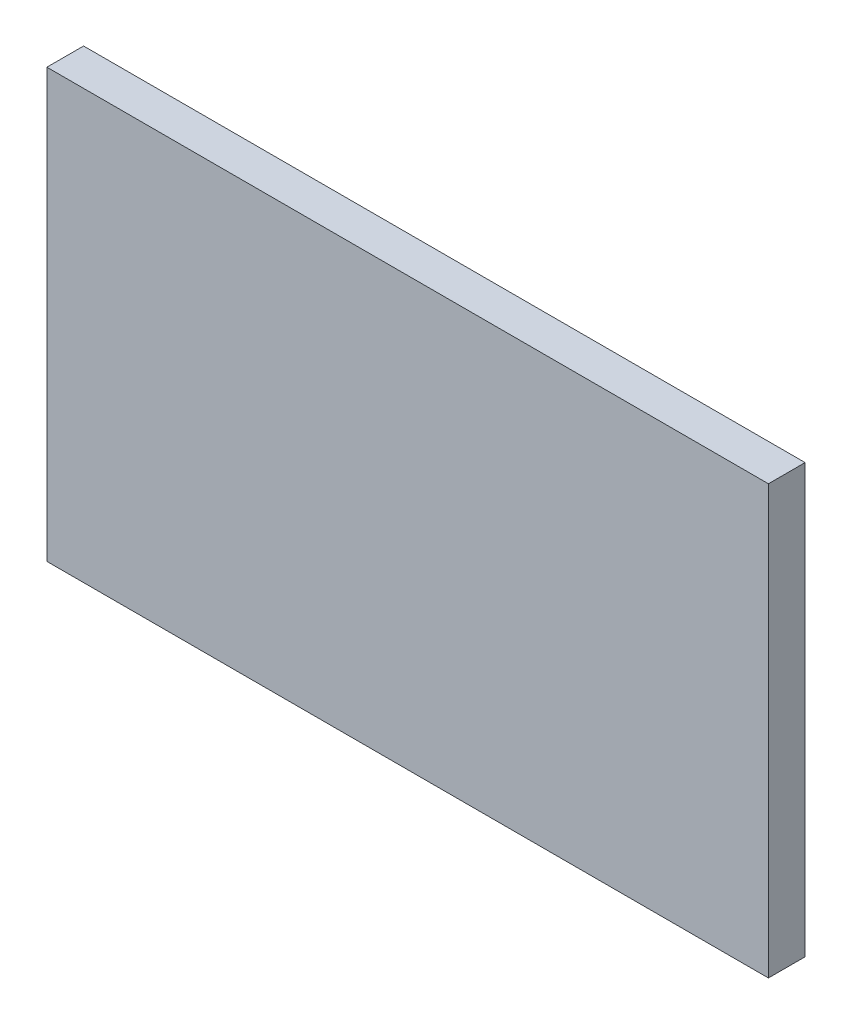
ISO-10303-21;
HEADER;
FILE_DESCRIPTION(('STEP AP214'),'2;1');
FILE_NAME('part.step','',(''),(''),'','','');
FILE_SCHEMA(('AUTOMOTIVE_DESIGN { 1 0 10303 214 1 1 1 1 }'));
ENDSEC;
DATA;
#1=APPLICATION_CONTEXT('core data for automotive mechanical design processes');
#2=APPLICATION_PROTOCOL_DEFINITION('international standard','automotive_design',2000,#1);
#3=PRODUCT_CONTEXT('',#1,'mechanical');
#4=PRODUCT('Part','Part','',(#3));
#5=PRODUCT_RELATED_PRODUCT_CATEGORY('part','',(#4));
#6=PRODUCT_DEFINITION_FORMATION('','',#4);
#7=PRODUCT_DEFINITION_CONTEXT('part definition',#1,'design');
#8=PRODUCT_DEFINITION('design','',#6,#7);
#9=PRODUCT_DEFINITION_SHAPE('','',#8);
#10=(LENGTH_UNIT() NAMED_UNIT(*) SI_UNIT(.MILLI.,.METRE.));
#11=(NAMED_UNIT(*) PLANE_ANGLE_UNIT() SI_UNIT($,.RADIAN.));
#12=(NAMED_UNIT(*) SI_UNIT($,.STERADIAN.) SOLID_ANGLE_UNIT());
#13=UNCERTAINTY_MEASURE_WITH_UNIT(LENGTH_MEASURE(1.E-05),#10,'distance_accuracy_value','');
#14=(GEOMETRIC_REPRESENTATION_CONTEXT(3) GLOBAL_UNCERTAINTY_ASSIGNED_CONTEXT((#13)) GLOBAL_UNIT_ASSIGNED_CONTEXT((#10,
#11,#12)) REPRESENTATION_CONTEXT('',''));
#15=CARTESIAN_POINT('',(0.,0.,0.));
#16=DIRECTION('',(0.,0.,1.));
#17=DIRECTION('',(1.,0.,0.));
#18=AXIS2_PLACEMENT_3D('',#15,#16,#17);
#19=CARTESIAN_POINT('',(-56.8687069422364,35.,6.));
#20=DIRECTION('',(0.,-1.,0.));
#21=DIRECTION('',(0.,0.,-1.));
#22=AXIS2_PLACEMENT_3D('',#19,#20,#21);
#23=PLANE('',#22);
#24=DIRECTION('',(-1.,0.,0.));
#25=VECTOR('',#24,1.);
#26=CARTESIAN_POINT('',(-56.8687069422364,35.,0.));
#27=LINE('',#26,#25);
#28=CARTESIAN_POINT('',(61.1312930577636,35.,0.));
#29=VERTEX_POINT('',#28);
#30=CARTESIAN_POINT('',(-56.8687069422364,35.,0.));
#31=VERTEX_POINT('',#30);
#32=EDGE_CURVE('E87',#29,#31,#27,.T.);
#33=ORIENTED_EDGE('',*,*,#32,.T.);
#34=DIRECTION('',(0.,0.,-1.));
#35=VECTOR('',#34,1.);
#36=CARTESIAN_POINT('',(-56.8687069422364,35.,6.));
#37=LINE('',#36,#35);
#38=CARTESIAN_POINT('',(-56.8687069422364,35.,6.));
#39=VERTEX_POINT('',#38);
#40=EDGE_CURVE('E41',#39,#31,#37,.T.);
#41=ORIENTED_EDGE('',*,*,#40,.F.);
#42=DIRECTION('',(-1.,0.,0.));
#43=VECTOR('',#42,1.);
#44=CARTESIAN_POINT('',(-56.8687069422364,35.,6.));
#45=LINE('',#44,#43);
#46=CARTESIAN_POINT('',(61.1312930577636,35.,6.));
#47=VERTEX_POINT('',#46);
#48=EDGE_CURVE('E80',#47,#39,#45,.T.);
#49=ORIENTED_EDGE('',*,*,#48,.F.);
#50=DIRECTION('',(0.,0.,-1.));
#51=VECTOR('',#50,1.);
#52=CARTESIAN_POINT('',(61.1312930577636,35.,6.));
#53=LINE('',#52,#51);
#54=EDGE_CURVE('E11',#47,#29,#53,.T.);
#55=ORIENTED_EDGE('',*,*,#54,.T.);
#56=EDGE_LOOP('',(#33,#41,#49,#55));
#57=FACE_BOUND('',#56,.T.);
#58=ADVANCED_FACE('F33',(#57),#23,.F.);
#59=CARTESIAN_POINT('',(-56.8687069422364,-35.,6.));
#60=DIRECTION('',(1.,0.,0.));
#61=DIRECTION('',(0.,0.,-1.));
#62=AXIS2_PLACEMENT_3D('',#59,#60,#61);
#63=PLANE('',#62);
#64=DIRECTION('',(0.,-1.,0.));
#65=VECTOR('',#64,1.);
#66=CARTESIAN_POINT('',(-56.8687069422364,-35.,0.));
#67=LINE('',#66,#65);
#68=CARTESIAN_POINT('',(-56.8687069422364,-35.,0.));
#69=VERTEX_POINT('',#68);
#70=EDGE_CURVE('E67',#31,#69,#67,.T.);
#71=ORIENTED_EDGE('',*,*,#70,.T.);
#72=DIRECTION('',(0.,0.,-1.));
#73=VECTOR('',#72,1.);
#74=CARTESIAN_POINT('',(-56.8687069422364,-35.,6.));
#75=LINE('',#74,#73);
#76=CARTESIAN_POINT('',(-56.8687069422364,-35.,6.));
#77=VERTEX_POINT('',#76);
#78=EDGE_CURVE('E88',#77,#69,#75,.T.);
#79=ORIENTED_EDGE('',*,*,#78,.F.);
#80=DIRECTION('',(0.,-1.,0.));
#81=VECTOR('',#80,1.);
#82=CARTESIAN_POINT('',(-56.8687069422364,-35.,6.));
#83=LINE('',#82,#81);
#84=EDGE_CURVE('E84',#39,#77,#83,.T.);
#85=ORIENTED_EDGE('',*,*,#84,.F.);
#86=ORIENTED_EDGE('',*,*,#40,.T.);
#87=EDGE_LOOP('',(#71,#79,#85,#86));
#88=FACE_BOUND('',#87,.T.);
#89=ADVANCED_FACE('F89',(#88),#63,.F.);
#90=CARTESIAN_POINT('',(61.1312930577636,-35.,6.));
#91=DIRECTION('',(0.,1.,0.));
#92=DIRECTION('',(-1.,0.,0.));
#93=AXIS2_PLACEMENT_3D('',#90,#91,#92);
#94=PLANE('',#93);
#95=DIRECTION('',(1.,0.,0.));
#96=VECTOR('',#95,1.);
#97=CARTESIAN_POINT('',(61.1312930577636,-35.,0.));
#98=LINE('',#97,#96);
#99=CARTESIAN_POINT('',(61.1312930577636,-35.,0.));
#100=VERTEX_POINT('',#99);
#101=EDGE_CURVE('E74',#69,#100,#98,.T.);
#102=ORIENTED_EDGE('',*,*,#101,.T.);
#103=DIRECTION('',(0.,0.,-1.));
#104=VECTOR('',#103,1.);
#105=CARTESIAN_POINT('',(61.1312930577636,-35.,6.));
#106=LINE('',#105,#104);
#107=CARTESIAN_POINT('',(61.1312930577636,-35.,6.));
#108=VERTEX_POINT('',#107);
#109=EDGE_CURVE('E93',#108,#100,#106,.T.);
#110=ORIENTED_EDGE('',*,*,#109,.F.);
#111=DIRECTION('',(1.,0.,0.));
#112=VECTOR('',#111,1.);
#113=CARTESIAN_POINT('',(61.1312930577636,-35.,6.));
#114=LINE('',#113,#112);
#115=EDGE_CURVE('E91',#77,#108,#114,.T.);
#116=ORIENTED_EDGE('',*,*,#115,.F.);
#117=ORIENTED_EDGE('',*,*,#78,.T.);
#118=EDGE_LOOP('',(#102,#110,#116,#117));
#119=FACE_BOUND('',#118,.T.);
#120=ADVANCED_FACE('F103',(#119),#94,.F.);
#121=CARTESIAN_POINT('',(61.1312930577636,0.,6.));
#122=DIRECTION('',(-1.,0.,0.));
#123=DIRECTION('',(0.,0.,1.));
#124=AXIS2_PLACEMENT_3D('',#121,#122,#123);
#125=PLANE('',#124);
#126=DIRECTION('',(0.,1.,0.));
#127=VECTOR('',#126,1.);
#128=CARTESIAN_POINT('',(61.1312930577636,0.,0.));
#129=LINE('',#128,#127);
#130=EDGE_CURVE('E100',#100,#29,#129,.T.);
#131=ORIENTED_EDGE('',*,*,#130,.T.);
#132=ORIENTED_EDGE('',*,*,#54,.F.);
#133=DIRECTION('',(0.,1.,0.));
#134=VECTOR('',#133,1.);
#135=CARTESIAN_POINT('',(61.1312930577636,35.,6.));
#136=LINE('',#135,#134);
#137=EDGE_CURVE('E49',#108,#47,#136,.T.);
#138=ORIENTED_EDGE('',*,*,#137,.F.);
#139=ORIENTED_EDGE('',*,*,#109,.T.);
#140=EDGE_LOOP('',(#131,#132,#138,#139));
#141=FACE_BOUND('',#140,.T.);
#142=ADVANCED_FACE('F107',(#141),#125,.F.);
#143=CARTESIAN_POINT('',(0.,0.,6.));
#144=DIRECTION('',(0.,0.,-1.));
#145=DIRECTION('',(-1.,0.,0.));
#146=AXIS2_PLACEMENT_3D('',#143,#144,#145);
#147=PLANE('',#146);
#148=ORIENTED_EDGE('',*,*,#137,.T.);
#149=ORIENTED_EDGE('',*,*,#48,.T.);
#150=ORIENTED_EDGE('',*,*,#84,.T.);
#151=ORIENTED_EDGE('',*,*,#115,.T.);
#152=EDGE_LOOP('',(#148,#149,#150,#151));
#153=FACE_BOUND('',#152,.T.);
#154=ADVANCED_FACE('F82',(#153),#147,.F.);
#155=CARTESIAN_POINT('',(0.,0.,0.));
#156=DIRECTION('',(0.,0.,-1.));
#157=DIRECTION('',(-1.,0.,0.));
#158=AXIS2_PLACEMENT_3D('',#155,#156,#157);
#159=PLANE('',#158);
#160=ORIENTED_EDGE('',*,*,#32,.F.);
#161=ORIENTED_EDGE('',*,*,#130,.F.);
#162=ORIENTED_EDGE('',*,*,#101,.F.);
#163=ORIENTED_EDGE('',*,*,#70,.F.);
#164=EDGE_LOOP('',(#160,#161,#162,#163));
#165=FACE_BOUND('',#164,.T.);
#166=ADVANCED_FACE('F106',(#165),#159,.T.);
#167=CLOSED_SHELL('',(#58,#89,#120,#142,#154,#166));
#168=MANIFOLD_SOLID_BREP('B2',#167);
#169=ADVANCED_BREP_SHAPE_REPRESENTATION('',(#18,#168),#14);
#170=SHAPE_DEFINITION_REPRESENTATION(#9,#169);
ENDSEC;
END-ISO-10303-21;
